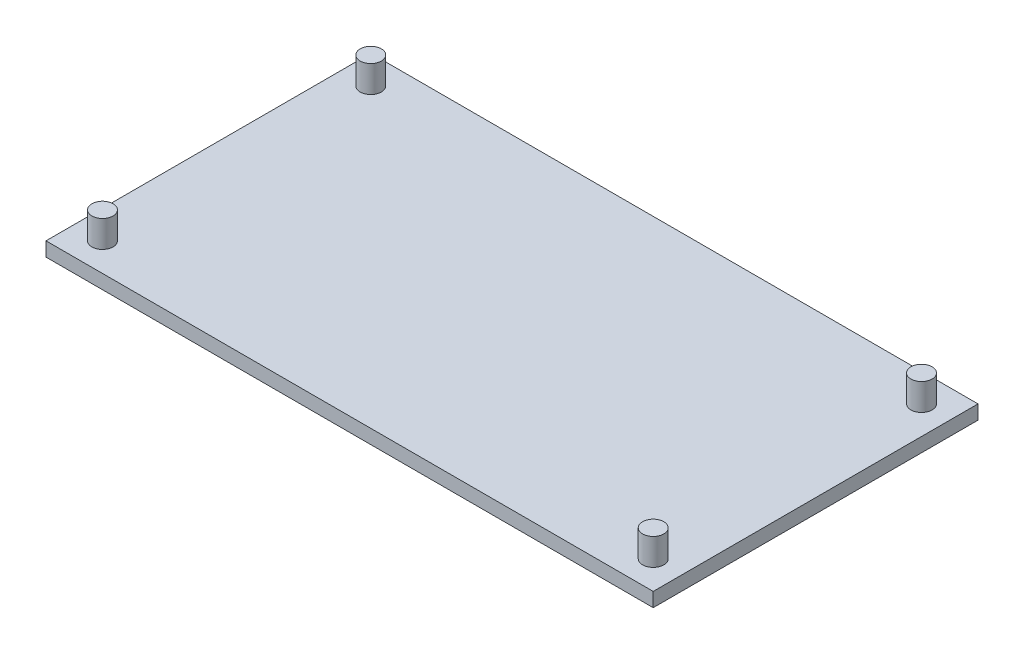
ISO-10303-21;
HEADER;
FILE_DESCRIPTION(('STEP AP214'),'2;1');
FILE_NAME('part.step','',(''),(''),'','','');
FILE_SCHEMA(('AUTOMOTIVE_DESIGN { 1 0 10303 214 1 1 1 1 }'));
ENDSEC;
DATA;
#1=APPLICATION_CONTEXT('core data for automotive mechanical design processes');
#2=APPLICATION_PROTOCOL_DEFINITION('international standard','automotive_design',2000,#1);
#3=PRODUCT_CONTEXT('',#1,'mechanical');
#4=PRODUCT('Part','Part','',(#3));
#5=PRODUCT_RELATED_PRODUCT_CATEGORY('part','',(#4));
#6=PRODUCT_DEFINITION_FORMATION('','',#4);
#7=PRODUCT_DEFINITION_CONTEXT('part definition',#1,'design');
#8=PRODUCT_DEFINITION('design','',#6,#7);
#9=PRODUCT_DEFINITION_SHAPE('','',#8);
#10=(LENGTH_UNIT() NAMED_UNIT(*) SI_UNIT(.MILLI.,.METRE.));
#11=(NAMED_UNIT(*) PLANE_ANGLE_UNIT() SI_UNIT($,.RADIAN.));
#12=(NAMED_UNIT(*) SI_UNIT($,.STERADIAN.) SOLID_ANGLE_UNIT());
#13=UNCERTAINTY_MEASURE_WITH_UNIT(LENGTH_MEASURE(1.E-05),#10,'distance_accuracy_value','');
#14=(GEOMETRIC_REPRESENTATION_CONTEXT(3) GLOBAL_UNCERTAINTY_ASSIGNED_CONTEXT((#13)) GLOBAL_UNIT_ASSIGNED_CONTEXT((#10,
#11,#12)) REPRESENTATION_CONTEXT('',''));
#15=CARTESIAN_POINT('',(0.,0.,0.));
#16=DIRECTION('',(0.,0.,1.));
#17=DIRECTION('',(1.,0.,0.));
#18=AXIS2_PLACEMENT_3D('',#15,#16,#17);
#19=CARTESIAN_POINT('',(43.,2.,23.));
#20=DIRECTION('',(-1.,0.,0.));
#21=DIRECTION('',(0.,0.,1.));
#22=AXIS2_PLACEMENT_3D('',#19,#20,#21);
#23=PLANE('',#22);
#24=DIRECTION('',(0.,0.,-1.));
#25=VECTOR('',#24,1.);
#26=CARTESIAN_POINT('',(43.,0.,23.));
#27=LINE('',#26,#25);
#28=CARTESIAN_POINT('',(43.,0.,23.));
#29=VERTEX_POINT('',#28);
#30=CARTESIAN_POINT('',(43.,0.,-23.));
#31=VERTEX_POINT('',#30);
#32=EDGE_CURVE('E102',#29,#31,#27,.T.);
#33=ORIENTED_EDGE('',*,*,#32,.T.);
#34=DIRECTION('',(0.,-1.,0.));
#35=VECTOR('',#34,1.);
#36=CARTESIAN_POINT('',(43.,2.,-23.));
#37=LINE('',#36,#35);
#38=CARTESIAN_POINT('',(43.,2.,-23.));
#39=VERTEX_POINT('',#38);
#40=EDGE_CURVE('E11',#39,#31,#37,.T.);
#41=ORIENTED_EDGE('',*,*,#40,.F.);
#42=DIRECTION('',(0.,0.,-1.));
#43=VECTOR('',#42,1.);
#44=CARTESIAN_POINT('',(43.,2.,23.));
#45=LINE('',#44,#43);
#46=CARTESIAN_POINT('',(43.,2.,23.));
#47=VERTEX_POINT('',#46);
#48=EDGE_CURVE('E90',#47,#39,#45,.T.);
#49=ORIENTED_EDGE('',*,*,#48,.F.);
#50=DIRECTION('',(0.,-1.,0.));
#51=VECTOR('',#50,1.);
#52=CARTESIAN_POINT('',(43.,2.,23.));
#53=LINE('',#52,#51);
#54=EDGE_CURVE('E98',#47,#29,#53,.T.);
#55=ORIENTED_EDGE('',*,*,#54,.T.);
#56=EDGE_LOOP('',(#33,#41,#49,#55));
#57=FACE_BOUND('',#56,.T.);
#58=ADVANCED_FACE('F39',(#57),#23,.F.);
#59=CARTESIAN_POINT('',(-43.,2.,-23.));
#60=DIRECTION('',(0.,0.,1.));
#61=DIRECTION('',(1.,0.,0.));
#62=AXIS2_PLACEMENT_3D('',#59,#60,#61);
#63=PLANE('',#62);
#64=DIRECTION('',(-1.,0.,0.));
#65=VECTOR('',#64,1.);
#66=CARTESIAN_POINT('',(-43.,0.,-23.));
#67=LINE('',#66,#65);
#68=CARTESIAN_POINT('',(-43.,0.,-23.));
#69=VERTEX_POINT('',#68);
#70=EDGE_CURVE('E94',#31,#69,#67,.T.);
#71=ORIENTED_EDGE('',*,*,#70,.T.);
#72=DIRECTION('',(0.,-1.,0.));
#73=VECTOR('',#72,1.);
#74=CARTESIAN_POINT('',(-43.,2.,-23.));
#75=LINE('',#74,#73);
#76=CARTESIAN_POINT('',(-43.,2.,-23.));
#77=VERTEX_POINT('',#76);
#78=EDGE_CURVE('E47',#77,#69,#75,.T.);
#79=ORIENTED_EDGE('',*,*,#78,.F.);
#80=DIRECTION('',(-1.,0.,0.));
#81=VECTOR('',#80,1.);
#82=CARTESIAN_POINT('',(-43.,2.,-23.));
#83=LINE('',#82,#81);
#84=EDGE_CURVE('E85',#39,#77,#83,.T.);
#85=ORIENTED_EDGE('',*,*,#84,.F.);
#86=ORIENTED_EDGE('',*,*,#40,.T.);
#87=EDGE_LOOP('',(#71,#79,#85,#86));
#88=FACE_BOUND('',#87,.T.);
#89=ADVANCED_FACE('F93',(#88),#63,.F.);
#90=CARTESIAN_POINT('',(-43.,2.,23.));
#91=DIRECTION('',(1.,0.,0.));
#92=DIRECTION('',(0.,0.,-1.));
#93=AXIS2_PLACEMENT_3D('',#90,#91,#92);
#94=PLANE('',#93);
#95=DIRECTION('',(0.,0.,1.));
#96=VECTOR('',#95,1.);
#97=CARTESIAN_POINT('',(-43.,0.,23.));
#98=LINE('',#97,#96);
#99=CARTESIAN_POINT('',(-43.,0.,23.));
#100=VERTEX_POINT('',#99);
#101=EDGE_CURVE('E72',#69,#100,#98,.T.);
#102=ORIENTED_EDGE('',*,*,#101,.T.);
#103=DIRECTION('',(0.,-1.,0.));
#104=VECTOR('',#103,1.);
#105=CARTESIAN_POINT('',(-43.,2.,23.));
#106=LINE('',#105,#104);
#107=CARTESIAN_POINT('',(-43.,2.,23.));
#108=VERTEX_POINT('',#107);
#109=EDGE_CURVE('E95',#108,#100,#106,.T.);
#110=ORIENTED_EDGE('',*,*,#109,.F.);
#111=DIRECTION('',(0.,0.,1.));
#112=VECTOR('',#111,1.);
#113=CARTESIAN_POINT('',(-43.,2.,23.));
#114=LINE('',#113,#112);
#115=EDGE_CURVE('E88',#77,#108,#114,.T.);
#116=ORIENTED_EDGE('',*,*,#115,.F.);
#117=ORIENTED_EDGE('',*,*,#78,.T.);
#118=EDGE_LOOP('',(#102,#110,#116,#117));
#119=FACE_BOUND('',#118,.T.);
#120=ADVANCED_FACE('F96',(#119),#94,.F.);
#121=CARTESIAN_POINT('',(-43.,2.,23.));
#122=DIRECTION('',(0.,0.,-1.));
#123=DIRECTION('',(-1.,0.,0.));
#124=AXIS2_PLACEMENT_3D('',#121,#122,#123);
#125=PLANE('',#124);
#126=DIRECTION('',(1.,0.,0.));
#127=VECTOR('',#126,1.);
#128=CARTESIAN_POINT('',(-43.,0.,23.));
#129=LINE('',#128,#127);
#130=EDGE_CURVE('E78',#100,#29,#129,.T.);
#131=ORIENTED_EDGE('',*,*,#130,.T.);
#132=ORIENTED_EDGE('',*,*,#54,.F.);
#133=DIRECTION('',(1.,0.,0.));
#134=VECTOR('',#133,1.);
#135=CARTESIAN_POINT('',(-43.,2.,23.));
#136=LINE('',#135,#134);
#137=EDGE_CURVE('E55',#108,#47,#136,.T.);
#138=ORIENTED_EDGE('',*,*,#137,.F.);
#139=ORIENTED_EDGE('',*,*,#109,.T.);
#140=EDGE_LOOP('',(#131,#132,#138,#139));
#141=FACE_BOUND('',#140,.T.);
#142=ADVANCED_FACE('F110',(#141),#125,.F.);
#143=CARTESIAN_POINT('',(0.,2.,0.));
#144=DIRECTION('',(0.,-1.,0.));
#145=DIRECTION('',(0.,0.,-1.));
#146=AXIS2_PLACEMENT_3D('',#143,#144,#145);
#147=PLANE('',#146);
#148=CARTESIAN_POINT('',(39.,2.,-19.));
#149=DIRECTION('',(0.,-1.,0.));
#150=DIRECTION('',(0.,0.,-1.));
#151=AXIS2_PLACEMENT_3D('',#148,#149,#150);
#152=CIRCLE('',#151,1.5);
#153=CARTESIAN_POINT('',(39.,2.,-20.5));
#154=VERTEX_POINT('',#153);
#155=EDGE_CURVE('E133',#154,#154,#152,.T.);
#156=ORIENTED_EDGE('',*,*,#155,.T.);
#157=EDGE_LOOP('',(#156));
#158=FACE_BOUND('',#157,.T.);
#159=CARTESIAN_POINT('',(39.,2.,19.));
#160=DIRECTION('',(0.,-1.,0.));
#161=DIRECTION('',(0.,0.,-1.));
#162=AXIS2_PLACEMENT_3D('',#159,#160,#161);
#163=CIRCLE('',#162,1.5);
#164=CARTESIAN_POINT('',(39.,2.,17.5));
#165=VERTEX_POINT('',#164);
#166=EDGE_CURVE('E127',#165,#165,#163,.T.);
#167=ORIENTED_EDGE('',*,*,#166,.T.);
#168=EDGE_LOOP('',(#167));
#169=FACE_BOUND('',#168,.T.);
#170=CARTESIAN_POINT('',(-39.,2.,-19.));
#171=DIRECTION('',(0.,-1.,0.));
#172=DIRECTION('',(0.,0.,-1.));
#173=AXIS2_PLACEMENT_3D('',#170,#171,#172);
#174=CIRCLE('',#173,1.5);
#175=CARTESIAN_POINT('',(-39.,2.,-20.5));
#176=VERTEX_POINT('',#175);
#177=EDGE_CURVE('E121',#176,#176,#174,.T.);
#178=ORIENTED_EDGE('',*,*,#177,.T.);
#179=EDGE_LOOP('',(#178));
#180=FACE_BOUND('',#179,.T.);
#181=CARTESIAN_POINT('',(-39.,2.,19.));
#182=DIRECTION('',(0.,-1.,0.));
#183=DIRECTION('',(0.,0.,-1.));
#184=AXIS2_PLACEMENT_3D('',#181,#182,#183);
#185=CIRCLE('',#184,1.5);
#186=CARTESIAN_POINT('',(-39.,2.,17.5));
#187=VERTEX_POINT('',#186);
#188=EDGE_CURVE('E105',#187,#187,#185,.T.);
#189=ORIENTED_EDGE('',*,*,#188,.T.);
#190=EDGE_LOOP('',(#189));
#191=FACE_BOUND('',#190,.T.);
#192=ORIENTED_EDGE('',*,*,#48,.T.);
#193=ORIENTED_EDGE('',*,*,#84,.T.);
#194=ORIENTED_EDGE('',*,*,#115,.T.);
#195=ORIENTED_EDGE('',*,*,#137,.T.);
#196=EDGE_LOOP('',(#192,#193,#194,#195));
#197=FACE_BOUND('',#196,.T.);
#198=ADVANCED_FACE('F86',(#158,#169,#180,#191,#197),#147,.F.);
#199=CARTESIAN_POINT('',(0.,0.,0.));
#200=DIRECTION('',(0.,-1.,0.));
#201=DIRECTION('',(0.,0.,-1.));
#202=AXIS2_PLACEMENT_3D('',#199,#200,#201);
#203=PLANE('',#202);
#204=ORIENTED_EDGE('',*,*,#32,.F.);
#205=ORIENTED_EDGE('',*,*,#130,.F.);
#206=ORIENTED_EDGE('',*,*,#101,.F.);
#207=ORIENTED_EDGE('',*,*,#70,.F.);
#208=EDGE_LOOP('',(#204,#205,#206,#207));
#209=FACE_BOUND('',#208,.T.);
#210=ADVANCED_FACE('F113',(#209),#203,.T.);
#211=CARTESIAN_POINT('',(-39.,5.8,19.));
#212=DIRECTION('',(0.,-1.,0.));
#213=DIRECTION('',(0.,0.,-1.));
#214=AXIS2_PLACEMENT_3D('',#211,#212,#213);
#215=CYLINDRICAL_SURFACE('',#214,1.5);
#216=CARTESIAN_POINT('',(-39.,5.8,19.));
#217=DIRECTION('',(0.,-1.,0.));
#218=DIRECTION('',(0.,0.,-1.));
#219=AXIS2_PLACEMENT_3D('',#216,#217,#218);
#220=CIRCLE('',#219,1.5);
#221=CARTESIAN_POINT('',(-39.,5.8,17.5));
#222=VERTEX_POINT('',#221);
#223=EDGE_CURVE('E118',#222,#222,#220,.T.);
#224=ORIENTED_EDGE('',*,*,#223,.T.);
#225=EDGE_LOOP('',(#224));
#226=FACE_BOUND('',#225,.T.);
#227=ORIENTED_EDGE('',*,*,#188,.F.);
#228=EDGE_LOOP('',(#227));
#229=FACE_BOUND('',#228,.T.);
#230=ADVANCED_FACE('F165',(#226,#229),#215,.T.);
#231=CARTESIAN_POINT('',(-39.,5.8,19.));
#232=DIRECTION('',(0.,-1.,0.));
#233=DIRECTION('',(0.,0.,-1.));
#234=AXIS2_PLACEMENT_3D('',#231,#232,#233);
#235=PLANE('',#234);
#236=ORIENTED_EDGE('',*,*,#223,.F.);
#237=EDGE_LOOP('',(#236));
#238=FACE_BOUND('',#237,.T.);
#239=ADVANCED_FACE('F171',(#238),#235,.F.);
#240=CARTESIAN_POINT('',(-39.,5.8,-19.));
#241=DIRECTION('',(0.,-1.,0.));
#242=DIRECTION('',(0.,0.,-1.));
#243=AXIS2_PLACEMENT_3D('',#240,#241,#242);
#244=CYLINDRICAL_SURFACE('',#243,1.5);
#245=CARTESIAN_POINT('',(-39.,5.8,-19.));
#246=DIRECTION('',(0.,-1.,0.));
#247=DIRECTION('',(0.,0.,-1.));
#248=AXIS2_PLACEMENT_3D('',#245,#246,#247);
#249=CIRCLE('',#248,1.5);
#250=CARTESIAN_POINT('',(-39.,5.8,-20.5));
#251=VERTEX_POINT('',#250);
#252=EDGE_CURVE('E124',#251,#251,#249,.T.);
#253=ORIENTED_EDGE('',*,*,#252,.T.);
#254=EDGE_LOOP('',(#253));
#255=FACE_BOUND('',#254,.T.);
#256=ORIENTED_EDGE('',*,*,#177,.F.);
#257=EDGE_LOOP('',(#256));
#258=FACE_BOUND('',#257,.T.);
#259=ADVANCED_FACE('F175',(#255,#258),#244,.T.);
#260=CARTESIAN_POINT('',(-39.,5.8,-19.));
#261=DIRECTION('',(0.,-1.,0.));
#262=DIRECTION('',(0.,0.,-1.));
#263=AXIS2_PLACEMENT_3D('',#260,#261,#262);
#264=PLANE('',#263);
#265=ORIENTED_EDGE('',*,*,#252,.F.);
#266=EDGE_LOOP('',(#265));
#267=FACE_BOUND('',#266,.T.);
#268=ADVANCED_FACE('F177',(#267),#264,.F.);
#269=CARTESIAN_POINT('',(39.,5.8,19.));
#270=DIRECTION('',(0.,-1.,0.));
#271=DIRECTION('',(0.,0.,-1.));
#272=AXIS2_PLACEMENT_3D('',#269,#270,#271);
#273=CYLINDRICAL_SURFACE('',#272,1.5);
#274=CARTESIAN_POINT('',(39.,5.8,19.));
#275=DIRECTION('',(0.,-1.,0.));
#276=DIRECTION('',(0.,0.,-1.));
#277=AXIS2_PLACEMENT_3D('',#274,#275,#276);
#278=CIRCLE('',#277,1.5);
#279=CARTESIAN_POINT('',(39.,5.8,17.5));
#280=VERTEX_POINT('',#279);
#281=EDGE_CURVE('E130',#280,#280,#278,.T.);
#282=ORIENTED_EDGE('',*,*,#281,.T.);
#283=EDGE_LOOP('',(#282));
#284=FACE_BOUND('',#283,.T.);
#285=ORIENTED_EDGE('',*,*,#166,.F.);
#286=EDGE_LOOP('',(#285));
#287=FACE_BOUND('',#286,.T.);
#288=ADVANCED_FACE('F180',(#284,#287),#273,.T.);
#289=CARTESIAN_POINT('',(39.,5.8,19.));
#290=DIRECTION('',(0.,-1.,0.));
#291=DIRECTION('',(0.,0.,-1.));
#292=AXIS2_PLACEMENT_3D('',#289,#290,#291);
#293=PLANE('',#292);
#294=ORIENTED_EDGE('',*,*,#281,.F.);
#295=EDGE_LOOP('',(#294));
#296=FACE_BOUND('',#295,.T.);
#297=ADVANCED_FACE('F149',(#296),#293,.F.);
#298=CARTESIAN_POINT('',(39.,5.8,-19.));
#299=DIRECTION('',(0.,-1.,0.));
#300=DIRECTION('',(0.,0.,-1.));
#301=AXIS2_PLACEMENT_3D('',#298,#299,#300);
#302=CYLINDRICAL_SURFACE('',#301,1.5);
#303=CARTESIAN_POINT('',(39.,5.8,-19.));
#304=DIRECTION('',(0.,-1.,0.));
#305=DIRECTION('',(0.,0.,-1.));
#306=AXIS2_PLACEMENT_3D('',#303,#304,#305);
#307=CIRCLE('',#306,1.5);
#308=CARTESIAN_POINT('',(39.,5.8,-20.5));
#309=VERTEX_POINT('',#308);
#310=EDGE_CURVE('E136',#309,#309,#307,.T.);
#311=ORIENTED_EDGE('',*,*,#310,.T.);
#312=EDGE_LOOP('',(#311));
#313=FACE_BOUND('',#312,.T.);
#314=ORIENTED_EDGE('',*,*,#155,.F.);
#315=EDGE_LOOP('',(#314));
#316=FACE_BOUND('',#315,.T.);
#317=ADVANCED_FACE('F140',(#313,#316),#302,.T.);
#318=CARTESIAN_POINT('',(39.,5.8,-19.));
#319=DIRECTION('',(0.,-1.,0.));
#320=DIRECTION('',(0.,0.,-1.));
#321=AXIS2_PLACEMENT_3D('',#318,#319,#320);
#322=PLANE('',#321);
#323=ORIENTED_EDGE('',*,*,#310,.F.);
#324=EDGE_LOOP('',(#323));
#325=FACE_BOUND('',#324,.T.);
#326=ADVANCED_FACE('F143',(#325),#322,.F.);
#327=CLOSED_SHELL('',(#58,#89,#120,#142,#198,#210,#230,#239,#259,#268,#288,#297,#317,#326));
#328=MANIFOLD_SOLID_BREP('B2',#327);
#329=ADVANCED_BREP_SHAPE_REPRESENTATION('',(#18,#328),#14);
#330=SHAPE_DEFINITION_REPRESENTATION(#9,#329);
ENDSEC;
END-ISO-10303-21;
